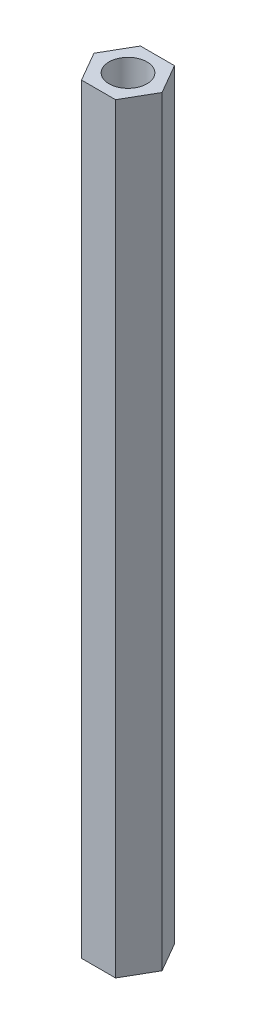
ISO-10303-21;
HEADER;
FILE_DESCRIPTION(('STEP AP214'),'2;1');
FILE_NAME('part.step','',(''),(''),'','','');
FILE_SCHEMA(('AUTOMOTIVE_DESIGN { 1 0 10303 214 1 1 1 1 }'));
ENDSEC;
DATA;
#1=APPLICATION_CONTEXT('core data for automotive mechanical design processes');
#2=APPLICATION_PROTOCOL_DEFINITION('international standard','automotive_design',2000,#1);
#3=PRODUCT_CONTEXT('',#1,'mechanical');
#4=PRODUCT('Part','Part','',(#3));
#5=PRODUCT_RELATED_PRODUCT_CATEGORY('part','',(#4));
#6=PRODUCT_DEFINITION_FORMATION('','',#4);
#7=PRODUCT_DEFINITION_CONTEXT('part definition',#1,'design');
#8=PRODUCT_DEFINITION('design','',#6,#7);
#9=PRODUCT_DEFINITION_SHAPE('','',#8);
#10=(LENGTH_UNIT() NAMED_UNIT(*) SI_UNIT(.MILLI.,.METRE.));
#11=(NAMED_UNIT(*) PLANE_ANGLE_UNIT() SI_UNIT($,.RADIAN.));
#12=(NAMED_UNIT(*) SI_UNIT($,.STERADIAN.) SOLID_ANGLE_UNIT());
#13=UNCERTAINTY_MEASURE_WITH_UNIT(LENGTH_MEASURE(1.E-05),#10,'distance_accuracy_value','');
#14=(GEOMETRIC_REPRESENTATION_CONTEXT(3) GLOBAL_UNCERTAINTY_ASSIGNED_CONTEXT((#13)) GLOBAL_UNIT_ASSIGNED_CONTEXT((#10,
#11,#12)) REPRESENTATION_CONTEXT('',''));
#15=CARTESIAN_POINT('',(0.,0.,0.));
#16=DIRECTION('',(0.,0.,1.));
#17=DIRECTION('',(1.,0.,0.));
#18=AXIS2_PLACEMENT_3D('',#15,#16,#17);
#19=CARTESIAN_POINT('',(0.,60.,0.));
#20=DIRECTION('',(0.,1.,0.));
#21=DIRECTION('',(0.,0.,1.));
#22=AXIS2_PLACEMENT_3D('',#19,#20,#21);
#23=PLANE('',#22);
#24=DIRECTION('',(0.5,0.,-0.866025403784439));
#25=VECTOR('',#24,1.);
#26=CARTESIAN_POINT('',(1.34233937586588,60.,2.325));
#27=LINE('',#26,#25);
#28=CARTESIAN_POINT('',(1.34233937586588,60.,2.325));
#29=VERTEX_POINT('',#28);
#30=CARTESIAN_POINT('',(2.68467875173176,60.,0.));
#31=VERTEX_POINT('',#30);
#32=EDGE_CURVE('E149',#29,#31,#27,.T.);
#33=ORIENTED_EDGE('',*,*,#32,.T.);
#34=DIRECTION('',(-0.5,0.,-0.866025403784439));
#35=VECTOR('',#34,1.);
#36=CARTESIAN_POINT('',(2.68467875173176,60.,0.));
#37=LINE('',#36,#35);
#38=CARTESIAN_POINT('',(1.34233937586588,60.,-2.325));
#39=VERTEX_POINT('',#38);
#40=EDGE_CURVE('E97',#31,#39,#37,.T.);
#41=ORIENTED_EDGE('',*,*,#40,.T.);
#42=DIRECTION('',(-1.,0.,0.));
#43=VECTOR('',#42,1.);
#44=CARTESIAN_POINT('',(1.34233937586588,60.,-2.325));
#45=LINE('',#44,#43);
#46=CARTESIAN_POINT('',(-1.34233937586588,60.,-2.325));
#47=VERTEX_POINT('',#46);
#48=EDGE_CURVE('E110',#39,#47,#45,.T.);
#49=ORIENTED_EDGE('',*,*,#48,.T.);
#50=DIRECTION('',(-0.499999999999999,0.,0.866025403784439));
#51=VECTOR('',#50,1.);
#52=CARTESIAN_POINT('',(-1.34233937586588,60.,-2.325));
#53=LINE('',#52,#51);
#54=CARTESIAN_POINT('',(-2.68467875173176,60.,0.));
#55=VERTEX_POINT('',#54);
#56=EDGE_CURVE('E104',#47,#55,#53,.T.);
#57=ORIENTED_EDGE('',*,*,#56,.T.);
#58=DIRECTION('',(0.5,0.,0.866025403784439));
#59=VECTOR('',#58,1.);
#60=CARTESIAN_POINT('',(-2.68467875173176,60.,0.));
#61=LINE('',#60,#59);
#62=CARTESIAN_POINT('',(-1.34233937586588,60.,2.325));
#63=VERTEX_POINT('',#62);
#64=EDGE_CURVE('E108',#55,#63,#61,.T.);
#65=ORIENTED_EDGE('',*,*,#64,.T.);
#66=DIRECTION('',(1.,0.,0.));
#67=VECTOR('',#66,1.);
#68=CARTESIAN_POINT('',(-1.34233937586588,60.,2.325));
#69=LINE('',#68,#67);
#70=EDGE_CURVE('E60',#63,#29,#69,.T.);
#71=ORIENTED_EDGE('',*,*,#70,.T.);
#72=EDGE_LOOP('',(#33,#41,#49,#57,#65,#71));
#73=FACE_BOUND('',#72,.T.);
#74=CARTESIAN_POINT('',(0.,60.,0.));
#75=DIRECTION('',(0.,1.,0.));
#76=DIRECTION('',(0.,0.,1.));
#77=AXIS2_PLACEMENT_3D('',#74,#75,#76);
#78=CIRCLE('',#77,1.5);
#79=CARTESIAN_POINT('',(0.,60.,1.5));
#80=VERTEX_POINT('',#79);
#81=EDGE_CURVE('E137',#80,#80,#78,.T.);
#82=ORIENTED_EDGE('',*,*,#81,.F.);
#83=EDGE_LOOP('',(#82));
#84=FACE_BOUND('',#83,.T.);
#85=ADVANCED_FACE('F42',(#73,#84),#23,.T.);
#86=CARTESIAN_POINT('',(0.,0.,0.));
#87=DIRECTION('',(0.,1.,0.));
#88=DIRECTION('',(0.,0.,1.));
#89=AXIS2_PLACEMENT_3D('',#86,#87,#88);
#90=PLANE('',#89);
#91=DIRECTION('',(0.5,0.,-0.866025403784439));
#92=VECTOR('',#91,1.);
#93=CARTESIAN_POINT('',(1.34233937586588,0.,2.325));
#94=LINE('',#93,#92);
#95=CARTESIAN_POINT('',(1.34233937586588,0.,2.325));
#96=VERTEX_POINT('',#95);
#97=CARTESIAN_POINT('',(2.68467875173176,0.,0.));
#98=VERTEX_POINT('',#97);
#99=EDGE_CURVE('E132',#96,#98,#94,.T.);
#100=ORIENTED_EDGE('',*,*,#99,.F.);
#101=DIRECTION('',(1.,0.,0.));
#102=VECTOR('',#101,1.);
#103=CARTESIAN_POINT('',(-1.34233937586588,0.,2.325));
#104=LINE('',#103,#102);
#105=CARTESIAN_POINT('',(-1.34233937586588,0.,2.325));
#106=VERTEX_POINT('',#105);
#107=EDGE_CURVE('E89',#106,#96,#104,.T.);
#108=ORIENTED_EDGE('',*,*,#107,.F.);
#109=DIRECTION('',(0.5,0.,0.866025403784439));
#110=VECTOR('',#109,1.);
#111=CARTESIAN_POINT('',(-2.68467875173176,0.,0.));
#112=LINE('',#111,#110);
#113=CARTESIAN_POINT('',(-2.68467875173176,0.,0.));
#114=VERTEX_POINT('',#113);
#115=EDGE_CURVE('E83',#114,#106,#112,.T.);
#116=ORIENTED_EDGE('',*,*,#115,.F.);
#117=DIRECTION('',(-0.499999999999999,0.,0.866025403784439));
#118=VECTOR('',#117,1.);
#119=CARTESIAN_POINT('',(-1.34233937586588,0.,-2.325));
#120=LINE('',#119,#118);
#121=CARTESIAN_POINT('',(-1.34233937586588,0.,-2.325));
#122=VERTEX_POINT('',#121);
#123=EDGE_CURVE('E119',#122,#114,#120,.T.);
#124=ORIENTED_EDGE('',*,*,#123,.F.);
#125=DIRECTION('',(-1.,0.,0.));
#126=VECTOR('',#125,1.);
#127=CARTESIAN_POINT('',(1.34233937586588,0.,-2.325));
#128=LINE('',#127,#126);
#129=CARTESIAN_POINT('',(1.34233937586588,0.,-2.325));
#130=VERTEX_POINT('',#129);
#131=EDGE_CURVE('E140',#130,#122,#128,.T.);
#132=ORIENTED_EDGE('',*,*,#131,.F.);
#133=DIRECTION('',(-0.5,0.,-0.866025403784439));
#134=VECTOR('',#133,1.);
#135=CARTESIAN_POINT('',(2.68467875173176,0.,0.));
#136=LINE('',#135,#134);
#137=EDGE_CURVE('E136',#98,#130,#136,.T.);
#138=ORIENTED_EDGE('',*,*,#137,.F.);
#139=EDGE_LOOP('',(#100,#108,#116,#124,#132,#138));
#140=FACE_BOUND('',#139,.T.);
#141=CARTESIAN_POINT('',(0.,0.,0.));
#142=DIRECTION('',(0.,1.,0.));
#143=DIRECTION('',(0.,0.,1.));
#144=AXIS2_PLACEMENT_3D('',#141,#142,#143);
#145=CIRCLE('',#144,1.5);
#146=CARTESIAN_POINT('',(0.,0.,1.5));
#147=VERTEX_POINT('',#146);
#148=EDGE_CURVE('E264',#147,#147,#145,.T.);
#149=ORIENTED_EDGE('',*,*,#148,.T.);
#150=EDGE_LOOP('',(#149));
#151=FACE_BOUND('',#150,.T.);
#152=ADVANCED_FACE('F162',(#140,#151),#90,.F.);
#153=CARTESIAN_POINT('',(1.34233937586588,60.,2.325));
#154=DIRECTION('',(-0.866025403784439,0.,-0.5));
#155=DIRECTION('',(-0.5,0.,0.866025403784439));
#156=AXIS2_PLACEMENT_3D('',#153,#154,#155);
#157=PLANE('',#156);
#158=ORIENTED_EDGE('',*,*,#99,.T.);
#159=DIRECTION('',(0.,-1.,0.));
#160=VECTOR('',#159,1.);
#161=CARTESIAN_POINT('',(2.68467875173176,60.,0.));
#162=LINE('',#161,#160);
#163=EDGE_CURVE('E11',#31,#98,#162,.T.);
#164=ORIENTED_EDGE('',*,*,#163,.F.);
#165=ORIENTED_EDGE('',*,*,#32,.F.);
#166=DIRECTION('',(0.,-1.,0.));
#167=VECTOR('',#166,1.);
#168=CARTESIAN_POINT('',(1.34233937586588,60.,2.325));
#169=LINE('',#168,#167);
#170=EDGE_CURVE('E128',#29,#96,#169,.T.);
#171=ORIENTED_EDGE('',*,*,#170,.T.);
#172=EDGE_LOOP('',(#158,#164,#165,#171));
#173=FACE_BOUND('',#172,.T.);
#174=ADVANCED_FACE('F44',(#173),#157,.F.);
#175=CARTESIAN_POINT('',(2.68467875173176,60.,0.));
#176=DIRECTION('',(-0.866025403784439,0.,0.5));
#177=DIRECTION('',(0.5,0.,0.866025403784439));
#178=AXIS2_PLACEMENT_3D('',#175,#176,#177);
#179=PLANE('',#178);
#180=ORIENTED_EDGE('',*,*,#137,.T.);
#181=DIRECTION('',(0.,-1.,0.));
#182=VECTOR('',#181,1.);
#183=CARTESIAN_POINT('',(1.34233937586588,60.,-2.325));
#184=LINE('',#183,#182);
#185=EDGE_CURVE('E52',#39,#130,#184,.T.);
#186=ORIENTED_EDGE('',*,*,#185,.F.);
#187=ORIENTED_EDGE('',*,*,#40,.F.);
#188=ORIENTED_EDGE('',*,*,#163,.T.);
#189=EDGE_LOOP('',(#180,#186,#187,#188));
#190=FACE_BOUND('',#189,.T.);
#191=ADVANCED_FACE('F187',(#190),#179,.F.);
#192=CARTESIAN_POINT('',(1.34233937586588,60.,-2.325));
#193=DIRECTION('',(0.,0.,1.));
#194=DIRECTION('',(1.,0.,0.));
#195=AXIS2_PLACEMENT_3D('',#192,#193,#194);
#196=PLANE('',#195);
#197=ORIENTED_EDGE('',*,*,#131,.T.);
#198=DIRECTION('',(0.,-1.,0.));
#199=VECTOR('',#198,1.);
#200=CARTESIAN_POINT('',(-1.34233937586588,60.,-2.325));
#201=LINE('',#200,#199);
#202=EDGE_CURVE('E121',#47,#122,#201,.T.);
#203=ORIENTED_EDGE('',*,*,#202,.F.);
#204=ORIENTED_EDGE('',*,*,#48,.F.);
#205=ORIENTED_EDGE('',*,*,#185,.T.);
#206=EDGE_LOOP('',(#197,#203,#204,#205));
#207=FACE_BOUND('',#206,.T.);
#208=ADVANCED_FACE('F159',(#207),#196,.F.);
#209=CARTESIAN_POINT('',(-1.34233937586588,60.,-2.325));
#210=DIRECTION('',(0.866025403784439,0.,0.499999999999999));
#211=DIRECTION('',(0.499999999999999,0.,-0.866025403784439));
#212=AXIS2_PLACEMENT_3D('',#209,#210,#211);
#213=PLANE('',#212);
#214=ORIENTED_EDGE('',*,*,#123,.T.);
#215=DIRECTION('',(0.,-1.,0.));
#216=VECTOR('',#215,1.);
#217=CARTESIAN_POINT('',(-2.68467875173176,60.,0.));
#218=LINE('',#217,#216);
#219=EDGE_CURVE('E116',#55,#114,#218,.T.);
#220=ORIENTED_EDGE('',*,*,#219,.F.);
#221=ORIENTED_EDGE('',*,*,#56,.F.);
#222=ORIENTED_EDGE('',*,*,#202,.T.);
#223=EDGE_LOOP('',(#214,#220,#221,#222));
#224=FACE_BOUND('',#223,.T.);
#225=ADVANCED_FACE('F117',(#224),#213,.F.);
#226=CARTESIAN_POINT('',(-2.68467875173176,60.,0.));
#227=DIRECTION('',(0.866025403784439,0.,-0.5));
#228=DIRECTION('',(-0.5,0.,-0.866025403784439));
#229=AXIS2_PLACEMENT_3D('',#226,#227,#228);
#230=PLANE('',#229);
#231=ORIENTED_EDGE('',*,*,#115,.T.);
#232=DIRECTION('',(0.,-1.,0.));
#233=VECTOR('',#232,1.);
#234=CARTESIAN_POINT('',(-1.34233937586588,60.,2.325));
#235=LINE('',#234,#233);
#236=EDGE_CURVE('E122',#63,#106,#235,.T.);
#237=ORIENTED_EDGE('',*,*,#236,.F.);
#238=ORIENTED_EDGE('',*,*,#64,.F.);
#239=ORIENTED_EDGE('',*,*,#219,.T.);
#240=EDGE_LOOP('',(#231,#237,#238,#239));
#241=FACE_BOUND('',#240,.T.);
#242=ADVANCED_FACE('F124',(#241),#230,.F.);
#243=CARTESIAN_POINT('',(-1.34233937586588,60.,2.325));
#244=DIRECTION('',(0.,0.,-1.));
#245=DIRECTION('',(-1.,0.,0.));
#246=AXIS2_PLACEMENT_3D('',#243,#244,#245);
#247=PLANE('',#246);
#248=ORIENTED_EDGE('',*,*,#107,.T.);
#249=ORIENTED_EDGE('',*,*,#170,.F.);
#250=ORIENTED_EDGE('',*,*,#70,.F.);
#251=ORIENTED_EDGE('',*,*,#236,.T.);
#252=EDGE_LOOP('',(#248,#249,#250,#251));
#253=FACE_BOUND('',#252,.T.);
#254=ADVANCED_FACE('F167',(#253),#247,.F.);
#255=CARTESIAN_POINT('',(0.,60.,0.));
#256=DIRECTION('',(0.,-1.,0.));
#257=DIRECTION('',(0.,0.,-1.));
#258=AXIS2_PLACEMENT_3D('',#255,#256,#257);
#259=CYLINDRICAL_SURFACE('',#258,1.5);
#260=ORIENTED_EDGE('',*,*,#81,.T.);
#261=EDGE_LOOP('',(#260));
#262=FACE_BOUND('',#261,.T.);
#263=ORIENTED_EDGE('',*,*,#148,.F.);
#264=EDGE_LOOP('',(#263));
#265=FACE_BOUND('',#264,.T.);
#266=ADVANCED_FACE('F169',(#262,#265),#259,.F.);
#267=CLOSED_SHELL('',(#85,#152,#174,#191,#208,#225,#242,#254,#266));
#268=MANIFOLD_SOLID_BREP('B2',#267);
#269=ADVANCED_BREP_SHAPE_REPRESENTATION('',(#18,#268),#14);
#270=SHAPE_DEFINITION_REPRESENTATION(#9,#269);
ENDSEC;
END-ISO-10303-21;
